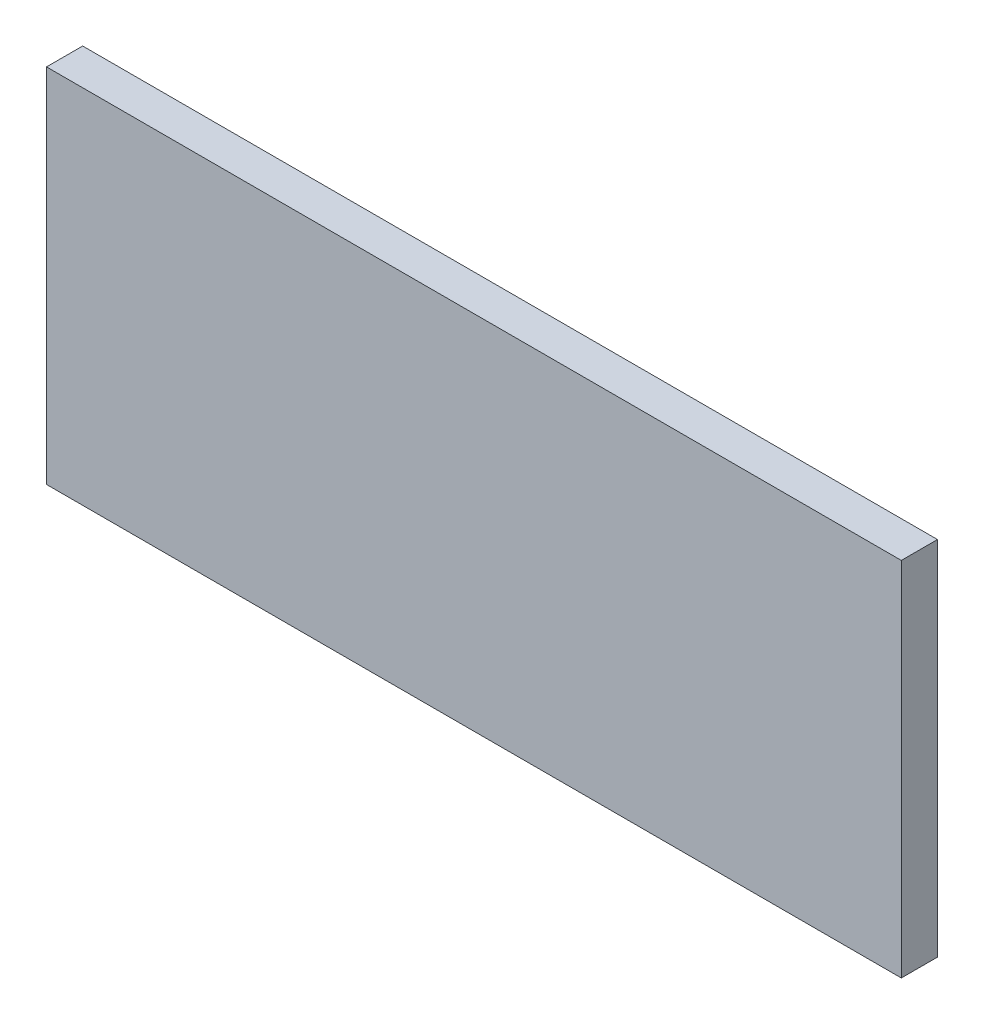
ISO-10303-21;
HEADER;
FILE_DESCRIPTION(('STEP AP214'),'2;1');
FILE_NAME('part.step','',(''),(''),'','','');
FILE_SCHEMA(('AUTOMOTIVE_DESIGN { 1 0 10303 214 1 1 1 1 }'));
ENDSEC;
DATA;
#1=APPLICATION_CONTEXT('core data for automotive mechanical design processes');
#2=APPLICATION_PROTOCOL_DEFINITION('international standard','automotive_design',2000,#1);
#3=PRODUCT_CONTEXT('',#1,'mechanical');
#4=PRODUCT('Part','Part','',(#3));
#5=PRODUCT_RELATED_PRODUCT_CATEGORY('part','',(#4));
#6=PRODUCT_DEFINITION_FORMATION('','',#4);
#7=PRODUCT_DEFINITION_CONTEXT('part definition',#1,'design');
#8=PRODUCT_DEFINITION('design','',#6,#7);
#9=PRODUCT_DEFINITION_SHAPE('','',#8);
#10=(LENGTH_UNIT() NAMED_UNIT(*) SI_UNIT(.MILLI.,.METRE.));
#11=(NAMED_UNIT(*) PLANE_ANGLE_UNIT() SI_UNIT($,.RADIAN.));
#12=(NAMED_UNIT(*) SI_UNIT($,.STERADIAN.) SOLID_ANGLE_UNIT());
#13=UNCERTAINTY_MEASURE_WITH_UNIT(LENGTH_MEASURE(1.E-05),#10,'distance_accuracy_value','');
#14=(GEOMETRIC_REPRESENTATION_CONTEXT(3) GLOBAL_UNCERTAINTY_ASSIGNED_CONTEXT((#13)) GLOBAL_UNIT_ASSIGNED_CONTEXT((#10,
#11,#12)) REPRESENTATION_CONTEXT('',''));
#15=CARTESIAN_POINT('',(0.,0.,0.));
#16=DIRECTION('',(0.,0.,1.));
#17=DIRECTION('',(1.,0.,0.));
#18=AXIS2_PLACEMENT_3D('',#15,#16,#17);
#19=CARTESIAN_POINT('',(26.,-11.,1.1));
#20=DIRECTION('',(-1.,0.,0.));
#21=DIRECTION('',(0.,0.,1.));
#22=AXIS2_PLACEMENT_3D('',#19,#20,#21);
#23=PLANE('',#22);
#24=DIRECTION('',(0.,1.,0.));
#25=VECTOR('',#24,1.);
#26=CARTESIAN_POINT('',(26.,-11.,-1.1));
#27=LINE('',#26,#25);
#28=CARTESIAN_POINT('',(26.,-11.,-1.1));
#29=VERTEX_POINT('',#28);
#30=CARTESIAN_POINT('',(26.,11.,-1.1));
#31=VERTEX_POINT('',#30);
#32=EDGE_CURVE('E96',#29,#31,#27,.T.);
#33=ORIENTED_EDGE('',*,*,#32,.T.);
#34=DIRECTION('',(0.,0.,-1.));
#35=VECTOR('',#34,1.);
#36=CARTESIAN_POINT('',(26.,11.,1.1));
#37=LINE('',#36,#35);
#38=CARTESIAN_POINT('',(26.,11.,1.1));
#39=VERTEX_POINT('',#38);
#40=EDGE_CURVE('E11',#39,#31,#37,.T.);
#41=ORIENTED_EDGE('',*,*,#40,.F.);
#42=DIRECTION('',(0.,1.,0.));
#43=VECTOR('',#42,1.);
#44=CARTESIAN_POINT('',(26.,-11.,1.1));
#45=LINE('',#44,#43);
#46=CARTESIAN_POINT('',(26.,-11.,1.1));
#47=VERTEX_POINT('',#46);
#48=EDGE_CURVE('E84',#47,#39,#45,.T.);
#49=ORIENTED_EDGE('',*,*,#48,.F.);
#50=DIRECTION('',(0.,0.,-1.));
#51=VECTOR('',#50,1.);
#52=CARTESIAN_POINT('',(26.,-11.,1.1));
#53=LINE('',#52,#51);
#54=EDGE_CURVE('E92',#47,#29,#53,.T.);
#55=ORIENTED_EDGE('',*,*,#54,.T.);
#56=EDGE_LOOP('',(#33,#41,#49,#55));
#57=FACE_BOUND('',#56,.T.);
#58=ADVANCED_FACE('F33',(#57),#23,.F.);
#59=CARTESIAN_POINT('',(-26.,11.,1.1));
#60=DIRECTION('',(0.,-1.,0.));
#61=DIRECTION('',(0.,0.,-1.));
#62=AXIS2_PLACEMENT_3D('',#59,#60,#61);
#63=PLANE('',#62);
#64=DIRECTION('',(-1.,0.,0.));
#65=VECTOR('',#64,1.);
#66=CARTESIAN_POINT('',(-26.,11.,-1.1));
#67=LINE('',#66,#65);
#68=CARTESIAN_POINT('',(-26.,11.,-1.1));
#69=VERTEX_POINT('',#68);
#70=EDGE_CURVE('E88',#31,#69,#67,.T.);
#71=ORIENTED_EDGE('',*,*,#70,.T.);
#72=DIRECTION('',(0.,0.,-1.));
#73=VECTOR('',#72,1.);
#74=CARTESIAN_POINT('',(-26.,11.,1.1));
#75=LINE('',#74,#73);
#76=CARTESIAN_POINT('',(-26.,11.,1.1));
#77=VERTEX_POINT('',#76);
#78=EDGE_CURVE('E41',#77,#69,#75,.T.);
#79=ORIENTED_EDGE('',*,*,#78,.F.);
#80=DIRECTION('',(-1.,0.,0.));
#81=VECTOR('',#80,1.);
#82=CARTESIAN_POINT('',(-26.,11.,1.1));
#83=LINE('',#82,#81);
#84=EDGE_CURVE('E79',#39,#77,#83,.T.);
#85=ORIENTED_EDGE('',*,*,#84,.F.);
#86=ORIENTED_EDGE('',*,*,#40,.T.);
#87=EDGE_LOOP('',(#71,#79,#85,#86));
#88=FACE_BOUND('',#87,.T.);
#89=ADVANCED_FACE('F87',(#88),#63,.F.);
#90=CARTESIAN_POINT('',(-26.,-11.,1.1));
#91=DIRECTION('',(1.,0.,0.));
#92=DIRECTION('',(0.,0.,-1.));
#93=AXIS2_PLACEMENT_3D('',#90,#91,#92);
#94=PLANE('',#93);
#95=DIRECTION('',(0.,-1.,0.));
#96=VECTOR('',#95,1.);
#97=CARTESIAN_POINT('',(-26.,-11.,-1.1));
#98=LINE('',#97,#96);
#99=CARTESIAN_POINT('',(-26.,-11.,-1.1));
#100=VERTEX_POINT('',#99);
#101=EDGE_CURVE('E66',#69,#100,#98,.T.);
#102=ORIENTED_EDGE('',*,*,#101,.T.);
#103=DIRECTION('',(0.,0.,-1.));
#104=VECTOR('',#103,1.);
#105=CARTESIAN_POINT('',(-26.,-11.,1.1));
#106=LINE('',#105,#104);
#107=CARTESIAN_POINT('',(-26.,-11.,1.1));
#108=VERTEX_POINT('',#107);
#109=EDGE_CURVE('E89',#108,#100,#106,.T.);
#110=ORIENTED_EDGE('',*,*,#109,.F.);
#111=DIRECTION('',(0.,-1.,0.));
#112=VECTOR('',#111,1.);
#113=CARTESIAN_POINT('',(-26.,-11.,1.1));
#114=LINE('',#113,#112);
#115=EDGE_CURVE('E82',#77,#108,#114,.T.);
#116=ORIENTED_EDGE('',*,*,#115,.F.);
#117=ORIENTED_EDGE('',*,*,#78,.T.);
#118=EDGE_LOOP('',(#102,#110,#116,#117));
#119=FACE_BOUND('',#118,.T.);
#120=ADVANCED_FACE('F90',(#119),#94,.F.);
#121=CARTESIAN_POINT('',(-26.,-11.,1.1));
#122=DIRECTION('',(0.,1.,0.));
#123=DIRECTION('',(0.,0.,1.));
#124=AXIS2_PLACEMENT_3D('',#121,#122,#123);
#125=PLANE('',#124);
#126=DIRECTION('',(1.,0.,0.));
#127=VECTOR('',#126,1.);
#128=CARTESIAN_POINT('',(-26.,-11.,-1.1));
#129=LINE('',#128,#127);
#130=EDGE_CURVE('E72',#100,#29,#129,.T.);
#131=ORIENTED_EDGE('',*,*,#130,.T.);
#132=ORIENTED_EDGE('',*,*,#54,.F.);
#133=DIRECTION('',(1.,0.,0.));
#134=VECTOR('',#133,1.);
#135=CARTESIAN_POINT('',(-26.,-11.,1.1));
#136=LINE('',#135,#134);
#137=EDGE_CURVE('E49',#108,#47,#136,.T.);
#138=ORIENTED_EDGE('',*,*,#137,.F.);
#139=ORIENTED_EDGE('',*,*,#109,.T.);
#140=EDGE_LOOP('',(#131,#132,#138,#139));
#141=FACE_BOUND('',#140,.T.);
#142=ADVANCED_FACE('F103',(#141),#125,.F.);
#143=CARTESIAN_POINT('',(0.,0.,1.1));
#144=DIRECTION('',(0.,0.,-1.));
#145=DIRECTION('',(-1.,0.,0.));
#146=AXIS2_PLACEMENT_3D('',#143,#144,#145);
#147=PLANE('',#146);
#148=ORIENTED_EDGE('',*,*,#48,.T.);
#149=ORIENTED_EDGE('',*,*,#84,.T.);
#150=ORIENTED_EDGE('',*,*,#115,.T.);
#151=ORIENTED_EDGE('',*,*,#137,.T.);
#152=EDGE_LOOP('',(#148,#149,#150,#151));
#153=FACE_BOUND('',#152,.T.);
#154=ADVANCED_FACE('F80',(#153),#147,.F.);
#155=CARTESIAN_POINT('',(0.,0.,-1.1));
#156=DIRECTION('',(0.,0.,-1.));
#157=DIRECTION('',(-1.,0.,0.));
#158=AXIS2_PLACEMENT_3D('',#155,#156,#157);
#159=PLANE('',#158);
#160=ORIENTED_EDGE('',*,*,#32,.F.);
#161=ORIENTED_EDGE('',*,*,#130,.F.);
#162=ORIENTED_EDGE('',*,*,#101,.F.);
#163=ORIENTED_EDGE('',*,*,#70,.F.);
#164=EDGE_LOOP('',(#160,#161,#162,#163));
#165=FACE_BOUND('',#164,.T.);
#166=ADVANCED_FACE('F106',(#165),#159,.T.);
#167=CLOSED_SHELL('',(#58,#89,#120,#142,#154,#166));
#168=MANIFOLD_SOLID_BREP('B2',#167);
#169=ADVANCED_BREP_SHAPE_REPRESENTATION('',(#18,#168),#14);
#170=SHAPE_DEFINITION_REPRESENTATION(#9,#169);
ENDSEC;
END-ISO-10303-21;
